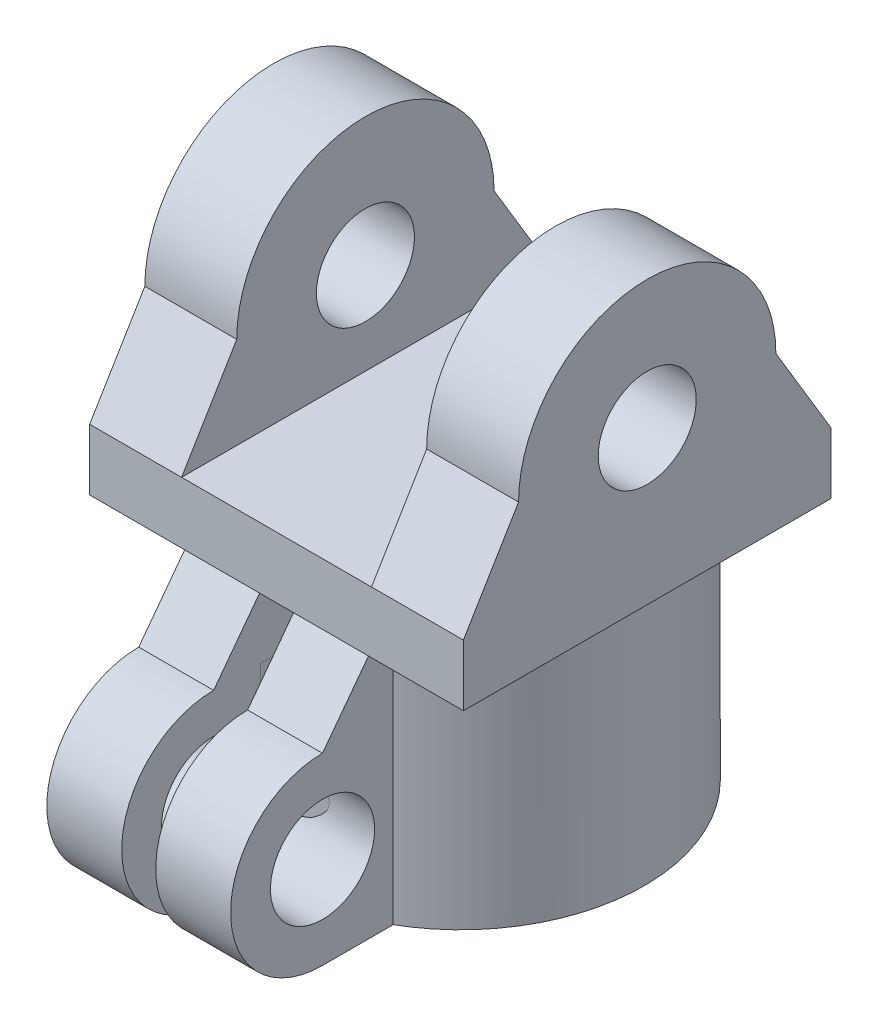
ISO-10303-21;
HEADER;
FILE_DESCRIPTION(('STEP AP214'),'2;1');
FILE_NAME('part.step','',(''),(''),'','','');
FILE_SCHEMA(('AUTOMOTIVE_DESIGN { 1 0 10303 214 1 1 1 1 }'));
ENDSEC;
DATA;
#1=APPLICATION_CONTEXT('core data for automotive mechanical design processes');
#2=APPLICATION_PROTOCOL_DEFINITION('international standard','automotive_design',2000,#1);
#3=PRODUCT_CONTEXT('',#1,'mechanical');
#4=PRODUCT('Part','Part','',(#3));
#5=PRODUCT_RELATED_PRODUCT_CATEGORY('part','',(#4));
#6=PRODUCT_DEFINITION_FORMATION('','',#4);
#7=PRODUCT_DEFINITION_CONTEXT('part definition',#1,'design');
#8=PRODUCT_DEFINITION('design','',#6,#7);
#9=PRODUCT_DEFINITION_SHAPE('','',#8);
#10=(LENGTH_UNIT() NAMED_UNIT(*) SI_UNIT(.MILLI.,.METRE.));
#11=(NAMED_UNIT(*) PLANE_ANGLE_UNIT() SI_UNIT($,.RADIAN.));
#12=(NAMED_UNIT(*) SI_UNIT($,.STERADIAN.) SOLID_ANGLE_UNIT());
#13=UNCERTAINTY_MEASURE_WITH_UNIT(LENGTH_MEASURE(1.E-05),#10,'distance_accuracy_value','');
#14=(GEOMETRIC_REPRESENTATION_CONTEXT(3) GLOBAL_UNCERTAINTY_ASSIGNED_CONTEXT((#13)) GLOBAL_UNIT_ASSIGNED_CONTEXT((#10,
#11,#12)) REPRESENTATION_CONTEXT('',''));
#15=CARTESIAN_POINT('',(0.,0.,0.));
#16=DIRECTION('',(0.,0.,1.));
#17=DIRECTION('',(1.,0.,0.));
#18=AXIS2_PLACEMENT_3D('',#15,#16,#17);
#19=CARTESIAN_POINT('',(-3.,8.,0.));
#20=DIRECTION('',(0.,0.,-1.));
#21=DIRECTION('',(-1.,0.,0.));
#22=AXIS2_PLACEMENT_3D('',#19,#20,#21);
#23=PLANE('',#22);
#24=DIRECTION('',(1.,0.,0.));
#25=VECTOR('',#24,1.);
#26=CARTESIAN_POINT('',(-3.,8.,0.));
#27=LINE('',#26,#25);
#28=CARTESIAN_POINT('',(-3.,8.,0.));
#29=VERTEX_POINT('',#28);
#30=CARTESIAN_POINT('',(-0.554698457996553,8.,0.));
#31=VERTEX_POINT('',#30);
#32=EDGE_CURVE('E131',#29,#31,#27,.T.);
#33=ORIENTED_EDGE('',*,*,#32,.T.);
#34=DIRECTION('',(0.,-1.,0.));
#35=VECTOR('',#34,1.);
#36=CARTESIAN_POINT('',(-0.554698457996553,8.,0.));
#37=LINE('',#36,#35);
#38=CARTESIAN_POINT('',(-0.554698457996553,6.,0.));
#39=VERTEX_POINT('',#38);
#40=EDGE_CURVE('E108',#31,#39,#37,.T.);
#41=ORIENTED_EDGE('',*,*,#40,.T.);
#42=DIRECTION('',(-1.,0.,0.));
#43=VECTOR('',#42,1.);
#44=CARTESIAN_POINT('',(-3.,6.,0.));
#45=LINE('',#44,#43);
#46=CARTESIAN_POINT('',(-3.,6.,0.));
#47=VERTEX_POINT('',#46);
#48=EDGE_CURVE('E137',#39,#47,#45,.T.);
#49=ORIENTED_EDGE('',*,*,#48,.T.);
#50=DIRECTION('',(0.,1.,0.));
#51=VECTOR('',#50,1.);
#52=CARTESIAN_POINT('',(-3.,8.,0.));
#53=LINE('',#52,#51);
#54=EDGE_CURVE('E136',#47,#29,#53,.T.);
#55=ORIENTED_EDGE('',*,*,#54,.T.);
#56=EDGE_LOOP('',(#33,#41,#49,#55));
#57=FACE_BOUND('',#56,.T.);
#58=ADVANCED_FACE('F44',(#57),#23,.T.);
#59=CARTESIAN_POINT('',(-3.,3.,7.5));
#60=DIRECTION('',(1.,0.,0.));
#61=DIRECTION('',(0.,0.,-1.));
#62=AXIS2_PLACEMENT_3D('',#59,#60,#61);
#63=CYLINDRICAL_SURFACE('',#62,3.);
#64=DIRECTION('',(1.,0.,0.));
#65=VECTOR('',#64,1.);
#66=CARTESIAN_POINT('',(-3.,0.,7.5));
#67=LINE('',#66,#65);
#68=CARTESIAN_POINT('',(-3.,0.,7.5));
#69=VERTEX_POINT('',#68);
#70=CARTESIAN_POINT('',(-0.554698457996553,0.,7.5));
#71=VERTEX_POINT('',#70);
#72=EDGE_CURVE('E133',#69,#71,#67,.T.);
#73=ORIENTED_EDGE('',*,*,#72,.T.);
#74=CARTESIAN_POINT('',(-0.554698457996553,3.,7.5));
#75=DIRECTION('',(1.,0.,0.));
#76=DIRECTION('',(0.,0.,-1.));
#77=AXIS2_PLACEMENT_3D('',#74,#75,#76);
#78=CIRCLE('',#77,3.);
#79=CARTESIAN_POINT('',(-0.554698457996553,6.,7.5));
#80=VERTEX_POINT('',#79);
#81=EDGE_CURVE('E62',#71,#80,#78,.F.);
#82=ORIENTED_EDGE('',*,*,#81,.T.);
#83=DIRECTION('',(1.,0.,0.));
#84=VECTOR('',#83,1.);
#85=CARTESIAN_POINT('',(-3.,6.,7.5));
#86=LINE('',#85,#84);
#87=CARTESIAN_POINT('',(-3.,6.,7.5));
#88=VERTEX_POINT('',#87);
#89=EDGE_CURVE('E120',#88,#80,#86,.T.);
#90=ORIENTED_EDGE('',*,*,#89,.F.);
#91=CARTESIAN_POINT('',(-3.,3.,7.5));
#92=DIRECTION('',(1.,0.,0.));
#93=DIRECTION('',(0.,0.,-1.));
#94=AXIS2_PLACEMENT_3D('',#91,#92,#93);
#95=CIRCLE('',#94,3.);
#96=EDGE_CURVE('E154',#88,#69,#95,.T.);
#97=ORIENTED_EDGE('',*,*,#96,.T.);
#98=EDGE_LOOP('',(#73,#82,#90,#97));
#99=FACE_BOUND('',#98,.T.);
#100=ADVANCED_FACE('F174',(#99),#63,.T.);
#101=CARTESIAN_POINT('',(-3.,6.,7.5));
#102=DIRECTION('',(0.,0.6,0.8));
#103=DIRECTION('',(0.,-0.8,0.6));
#104=AXIS2_PLACEMENT_3D('',#101,#102,#103);
#105=PLANE('',#104);
#106=ORIENTED_EDGE('',*,*,#89,.T.);
#107=DIRECTION('',(0.,0.8,-0.6));
#108=VECTOR('',#107,1.);
#109=CARTESIAN_POINT('',(-0.554698457996553,6.,7.5));
#110=LINE('',#109,#108);
#111=CARTESIAN_POINT('',(-0.554698457996553,8.,6.));
#112=VERTEX_POINT('',#111);
#113=EDGE_CURVE('E106',#80,#112,#110,.T.);
#114=ORIENTED_EDGE('',*,*,#113,.T.);
#115=DIRECTION('',(1.,0.,0.));
#116=VECTOR('',#115,1.);
#117=CARTESIAN_POINT('',(-3.,8.,6.));
#118=LINE('',#117,#116);
#119=CARTESIAN_POINT('',(-3.,8.,6.));
#120=VERTEX_POINT('',#119);
#121=EDGE_CURVE('E114',#120,#112,#118,.T.);
#122=ORIENTED_EDGE('',*,*,#121,.F.);
#123=DIRECTION('',(0.,-0.8,0.6));
#124=VECTOR('',#123,1.);
#125=CARTESIAN_POINT('',(-3.,6.,7.5));
#126=LINE('',#125,#124);
#127=EDGE_CURVE('E121',#120,#88,#126,.T.);
#128=ORIENTED_EDGE('',*,*,#127,.T.);
#129=EDGE_LOOP('',(#106,#114,#122,#128));
#130=FACE_BOUND('',#129,.T.);
#131=ADVANCED_FACE('F117',(#130),#105,.T.);
#132=CARTESIAN_POINT('',(-3.,8.,6.));
#133=DIRECTION('',(0.,1.,0.));
#134=DIRECTION('',(0.,0.,1.));
#135=AXIS2_PLACEMENT_3D('',#132,#133,#134);
#136=PLANE('',#135);
#137=ORIENTED_EDGE('',*,*,#121,.T.);
#138=DIRECTION('',(0.,0.,-1.));
#139=VECTOR('',#138,1.);
#140=CARTESIAN_POINT('',(-0.554698457996553,8.,10.5));
#141=LINE('',#140,#139);
#142=EDGE_CURVE('E102',#112,#31,#141,.T.);
#143=ORIENTED_EDGE('',*,*,#142,.T.);
#144=ORIENTED_EDGE('',*,*,#32,.F.);
#145=DIRECTION('',(0.,0.,1.));
#146=VECTOR('',#145,1.);
#147=CARTESIAN_POINT('',(-3.,8.,6.));
#148=LINE('',#147,#146);
#149=EDGE_CURVE('E113',#29,#120,#148,.T.);
#150=ORIENTED_EDGE('',*,*,#149,.T.);
#151=EDGE_LOOP('',(#137,#143,#144,#150));
#152=FACE_BOUND('',#151,.T.);
#153=ADVANCED_FACE('F123',(#152),#136,.T.);
#154=CARTESIAN_POINT('',(-3.,0.,0.));
#155=DIRECTION('',(0.,-1.,0.));
#156=DIRECTION('',(0.,0.,-1.));
#157=AXIS2_PLACEMENT_3D('',#154,#155,#156);
#158=PLANE('',#157);
#159=CARTESIAN_POINT('',(0.,0.,0.));
#160=DIRECTION('',(0.,-1.,0.));
#161=DIRECTION('',(0.,0.,-1.));
#162=AXIS2_PLACEMENT_3D('',#159,#160,#161);
#163=CIRCLE('',#162,4.2);
#164=CARTESIAN_POINT('',(-0.554698457996553,0.,4.16320905320598));
#165=VERTEX_POINT('',#164);
#166=CARTESIAN_POINT('',(-3.,0.,2.93938769133981));
#167=VERTEX_POINT('',#166);
#168=EDGE_CURVE('E47',#165,#167,#163,.T.);
#169=ORIENTED_EDGE('',*,*,#168,.F.);
#170=DIRECTION('',(0.,0.,-1.));
#171=VECTOR('',#170,1.);
#172=CARTESIAN_POINT('',(-0.554698457996553,0.,10.5));
#173=LINE('',#172,#171);
#174=EDGE_CURVE('E161',#71,#165,#173,.T.);
#175=ORIENTED_EDGE('',*,*,#174,.F.);
#176=ORIENTED_EDGE('',*,*,#72,.F.);
#177=DIRECTION('',(0.,0.,-1.));
#178=VECTOR('',#177,1.);
#179=CARTESIAN_POINT('',(-3.,0.,0.));
#180=LINE('',#179,#178);
#181=EDGE_CURVE('E148',#69,#167,#180,.T.);
#182=ORIENTED_EDGE('',*,*,#181,.T.);
#183=EDGE_LOOP('',(#169,#175,#176,#182));
#184=FACE_BOUND('',#183,.T.);
#185=ADVANCED_FACE('F177',(#184),#158,.T.);
#186=CARTESIAN_POINT('',(-3.,3.,7.5));
#187=DIRECTION('',(1.,0.,0.));
#188=DIRECTION('',(0.,0.,-1.));
#189=AXIS2_PLACEMENT_3D('',#186,#187,#188);
#190=CYLINDRICAL_SURFACE('',#189,1.7);
#191=CARTESIAN_POINT('',(-3.,3.,7.5));
#192=DIRECTION('',(1.,0.,0.));
#193=DIRECTION('',(0.,0.,-1.));
#194=AXIS2_PLACEMENT_3D('',#191,#192,#193);
#195=CIRCLE('',#194,1.7);
#196=CARTESIAN_POINT('',(-3.,3.,5.8));
#197=VERTEX_POINT('',#196);
#198=EDGE_CURVE('E144',#197,#197,#195,.T.);
#199=ORIENTED_EDGE('',*,*,#198,.F.);
#200=EDGE_LOOP('',(#199));
#201=FACE_BOUND('',#200,.T.);
#202=CARTESIAN_POINT('',(-0.554698457996553,3.,7.5));
#203=DIRECTION('',(1.,0.,0.));
#204=DIRECTION('',(0.,0.,-1.));
#205=AXIS2_PLACEMENT_3D('',#202,#203,#204);
#206=CIRCLE('',#205,1.7);
#207=CARTESIAN_POINT('',(-0.554698457996553,3.,5.8));
#208=VERTEX_POINT('',#207);
#209=EDGE_CURVE('E12',#208,#208,#206,.F.);
#210=ORIENTED_EDGE('',*,*,#209,.F.);
#211=EDGE_LOOP('',(#210));
#212=FACE_BOUND('',#211,.T.);
#213=ADVANCED_FACE('F181',(#201,#212),#190,.F.);
#214=CARTESIAN_POINT('',(0.,6.,0.));
#215=DIRECTION('',(0.,-1.,0.));
#216=DIRECTION('',(0.,0.,-1.));
#217=AXIS2_PLACEMENT_3D('',#214,#215,#216);
#218=CYLINDRICAL_SURFACE('',#217,4.2);
#219=DIRECTION('',(0.,-1.,0.));
#220=VECTOR('',#219,1.);
#221=CARTESIAN_POINT('',(-0.554698457996553,6.,4.16320905320598));
#222=LINE('',#221,#220);
#223=CARTESIAN_POINT('',(-0.554698457996553,6.,4.16320905320598));
#224=VERTEX_POINT('',#223);
#225=EDGE_CURVE('E53',#165,#224,#222,.F.);
#226=ORIENTED_EDGE('',*,*,#225,.F.);
#227=ORIENTED_EDGE('',*,*,#168,.T.);
#228=DIRECTION('',(0.,-1.,0.));
#229=VECTOR('',#228,1.);
#230=CARTESIAN_POINT('',(-3.,6.,2.93938769133981));
#231=LINE('',#230,#229);
#232=CARTESIAN_POINT('',(-3.,6.,2.93938769133981));
#233=VERTEX_POINT('',#232);
#234=EDGE_CURVE('E159',#233,#167,#231,.T.);
#235=ORIENTED_EDGE('',*,*,#234,.F.);
#236=CARTESIAN_POINT('',(0.,6.,0.));
#237=DIRECTION('',(0.,-1.,0.));
#238=DIRECTION('',(0.,0.,-1.));
#239=AXIS2_PLACEMENT_3D('',#236,#237,#238);
#240=CIRCLE('',#239,4.2);
#241=EDGE_CURVE('E138',#224,#233,#240,.T.);
#242=ORIENTED_EDGE('',*,*,#241,.F.);
#243=EDGE_LOOP('',(#226,#227,#235,#242));
#244=FACE_BOUND('',#243,.T.);
#245=ADVANCED_FACE('F179',(#244),#218,.F.);
#246=CARTESIAN_POINT('',(0.,6.,0.));
#247=DIRECTION('',(0.,-1.,0.));
#248=DIRECTION('',(0.,0.,-1.));
#249=AXIS2_PLACEMENT_3D('',#246,#247,#248);
#250=PLANE('',#249);
#251=ORIENTED_EDGE('',*,*,#48,.F.);
#252=DIRECTION('',(0.,0.,1.));
#253=VECTOR('',#252,1.);
#254=CARTESIAN_POINT('',(-0.554698457996553,6.,0.));
#255=LINE('',#254,#253);
#256=EDGE_CURVE('E75',#39,#224,#255,.T.);
#257=ORIENTED_EDGE('',*,*,#256,.T.);
#258=ORIENTED_EDGE('',*,*,#241,.T.);
#259=DIRECTION('',(0.,0.,-1.));
#260=VECTOR('',#259,1.);
#261=CARTESIAN_POINT('',(-3.,6.,7.5));
#262=LINE('',#261,#260);
#263=EDGE_CURVE('E139',#233,#47,#262,.T.);
#264=ORIENTED_EDGE('',*,*,#263,.T.);
#265=EDGE_LOOP('',(#251,#257,#258,#264));
#266=FACE_BOUND('',#265,.T.);
#267=ADVANCED_FACE('F166',(#266),#250,.T.);
#268=CARTESIAN_POINT('',(-3.,3.,7.5));
#269=DIRECTION('',(1.,0.,0.));
#270=DIRECTION('',(0.,0.,-1.));
#271=AXIS2_PLACEMENT_3D('',#268,#269,#270);
#272=PLANE('',#271);
#273=ORIENTED_EDGE('',*,*,#198,.T.);
#274=EDGE_LOOP('',(#273));
#275=FACE_BOUND('',#274,.T.);
#276=ORIENTED_EDGE('',*,*,#263,.F.);
#277=ORIENTED_EDGE('',*,*,#234,.T.);
#278=ORIENTED_EDGE('',*,*,#181,.F.);
#279=ORIENTED_EDGE('',*,*,#96,.F.);
#280=ORIENTED_EDGE('',*,*,#127,.F.);
#281=ORIENTED_EDGE('',*,*,#149,.F.);
#282=ORIENTED_EDGE('',*,*,#54,.F.);
#283=EDGE_LOOP('',(#276,#277,#278,#279,#280,#281,#282));
#284=FACE_BOUND('',#283,.T.);
#285=ADVANCED_FACE('F170',(#275,#284),#272,.F.);
#286=CARTESIAN_POINT('',(-0.554698457996553,8.,10.5));
#287=DIRECTION('',(1.,0.,0.));
#288=DIRECTION('',(0.,0.,-1.));
#289=AXIS2_PLACEMENT_3D('',#286,#287,#288);
#290=PLANE('',#289);
#291=ORIENTED_EDGE('',*,*,#174,.T.);
#292=ORIENTED_EDGE('',*,*,#225,.T.);
#293=ORIENTED_EDGE('',*,*,#256,.F.);
#294=ORIENTED_EDGE('',*,*,#40,.F.);
#295=ORIENTED_EDGE('',*,*,#142,.F.);
#296=ORIENTED_EDGE('',*,*,#113,.F.);
#297=ORIENTED_EDGE('',*,*,#81,.F.);
#298=EDGE_LOOP('',(#291,#292,#293,#294,#295,#296,#297));
#299=FACE_BOUND('',#298,.T.);
#300=ORIENTED_EDGE('',*,*,#209,.T.);
#301=EDGE_LOOP('',(#300));
#302=FACE_BOUND('',#301,.T.);
#303=ADVANCED_FACE('F104',(#299,#302),#290,.T.);
#304=CLOSED_SHELL('',(#58,#100,#131,#153,#185,#213,#245,#267,#285,#303));
#305=MANIFOLD_SOLID_BREP('B2',#304);
#306=CARTESIAN_POINT('',(-3.,3.,7.5));
#307=DIRECTION('',(1.,0.,0.));
#308=DIRECTION('',(0.,0.,-1.));
#309=AXIS2_PLACEMENT_3D('',#306,#307,#308);
#310=CYLINDRICAL_SURFACE('',#309,1.7);
#311=CARTESIAN_POINT('',(3.,3.,7.5));
#312=DIRECTION('',(1.,0.,0.));
#313=DIRECTION('',(0.,0.,-1.));
#314=AXIS2_PLACEMENT_3D('',#311,#312,#313);
#315=CIRCLE('',#314,1.7);
#316=CARTESIAN_POINT('',(3.,3.,5.8));
#317=VERTEX_POINT('',#316);
#318=EDGE_CURVE('E392',#317,#317,#315,.T.);
#319=ORIENTED_EDGE('',*,*,#318,.T.);
#320=EDGE_LOOP('',(#319));
#321=FACE_BOUND('',#320,.T.);
#322=CARTESIAN_POINT('',(0.554698457996553,3.,7.5));
#323=DIRECTION('',(-1.,0.,0.));
#324=DIRECTION('',(0.,0.,1.));
#325=AXIS2_PLACEMENT_3D('',#322,#323,#324);
#326=CIRCLE('',#325,1.7);
#327=CARTESIAN_POINT('',(0.554698457996553,3.,9.2));
#328=VERTEX_POINT('',#327);
#329=EDGE_CURVE('E405',#328,#328,#326,.F.);
#330=ORIENTED_EDGE('',*,*,#329,.F.);
#331=EDGE_LOOP('',(#330));
#332=FACE_BOUND('',#331,.T.);
#333=ADVANCED_FACE('F276',(#321,#332),#310,.F.);
#334=CARTESIAN_POINT('',(3.,3.,7.5));
#335=DIRECTION('',(1.,0.,0.));
#336=DIRECTION('',(0.,0.,-1.));
#337=AXIS2_PLACEMENT_3D('',#334,#335,#336);
#338=PLANE('',#337);
#339=DIRECTION('',(0.,-1.,0.));
#340=VECTOR('',#339,1.);
#341=CARTESIAN_POINT('',(3.,6.,2.93938769133981));
#342=LINE('',#341,#340);
#343=CARTESIAN_POINT('',(3.,6.,2.93938769133981));
#344=VERTEX_POINT('',#343);
#345=CARTESIAN_POINT('',(3.,0.,2.93938769133981));
#346=VERTEX_POINT('',#345);
#347=EDGE_CURVE('E284',#344,#346,#342,.T.);
#348=ORIENTED_EDGE('',*,*,#347,.F.);
#349=DIRECTION('',(0.,0.,-1.));
#350=VECTOR('',#349,1.);
#351=CARTESIAN_POINT('',(3.,6.,7.5));
#352=LINE('',#351,#350);
#353=CARTESIAN_POINT('',(3.,6.,0.));
#354=VERTEX_POINT('',#353);
#355=EDGE_CURVE('E361',#344,#354,#352,.T.);
#356=ORIENTED_EDGE('',*,*,#355,.T.);
#357=DIRECTION('',(0.,1.,0.));
#358=VECTOR('',#357,1.);
#359=CARTESIAN_POINT('',(3.,8.,0.));
#360=LINE('',#359,#358);
#361=CARTESIAN_POINT('',(3.,8.,0.));
#362=VERTEX_POINT('',#361);
#363=EDGE_CURVE('E389',#354,#362,#360,.T.);
#364=ORIENTED_EDGE('',*,*,#363,.T.);
#365=DIRECTION('',(0.,0.,1.));
#366=VECTOR('',#365,1.);
#367=CARTESIAN_POINT('',(3.,8.,6.));
#368=LINE('',#367,#366);
#369=CARTESIAN_POINT('',(3.,8.,6.));
#370=VERTEX_POINT('',#369);
#371=EDGE_CURVE('E351',#362,#370,#368,.T.);
#372=ORIENTED_EDGE('',*,*,#371,.T.);
#373=DIRECTION('',(0.,-0.8,0.6));
#374=VECTOR('',#373,1.);
#375=CARTESIAN_POINT('',(3.,6.,7.5));
#376=LINE('',#375,#374);
#377=CARTESIAN_POINT('',(3.,6.,7.5));
#378=VERTEX_POINT('',#377);
#379=EDGE_CURVE('E357',#370,#378,#376,.T.);
#380=ORIENTED_EDGE('',*,*,#379,.T.);
#381=CARTESIAN_POINT('',(3.,3.,7.5));
#382=DIRECTION('',(1.,0.,0.));
#383=DIRECTION('',(0.,0.,-1.));
#384=AXIS2_PLACEMENT_3D('',#381,#382,#383);
#385=CIRCLE('',#384,3.);
#386=CARTESIAN_POINT('',(3.,0.,7.5));
#387=VERTEX_POINT('',#386);
#388=EDGE_CURVE('E388',#378,#387,#385,.T.);
#389=ORIENTED_EDGE('',*,*,#388,.T.);
#390=DIRECTION('',(0.,0.,-1.));
#391=VECTOR('',#390,1.);
#392=CARTESIAN_POINT('',(3.,0.,0.));
#393=LINE('',#392,#391);
#394=EDGE_CURVE('E379',#387,#346,#393,.T.);
#395=ORIENTED_EDGE('',*,*,#394,.T.);
#396=EDGE_LOOP('',(#348,#356,#364,#372,#380,#389,#395));
#397=FACE_BOUND('',#396,.T.);
#398=ORIENTED_EDGE('',*,*,#318,.F.);
#399=EDGE_LOOP('',(#398));
#400=FACE_BOUND('',#399,.T.);
#401=ADVANCED_FACE('F384',(#397,#400),#338,.T.);
#402=CARTESIAN_POINT('',(-3.,8.,6.));
#403=DIRECTION('',(0.,1.,0.));
#404=DIRECTION('',(0.,0.,1.));
#405=AXIS2_PLACEMENT_3D('',#402,#403,#404);
#406=PLANE('',#405);
#407=DIRECTION('',(1.,0.,0.));
#408=VECTOR('',#407,1.);
#409=CARTESIAN_POINT('',(-3.,8.,0.));
#410=LINE('',#409,#408);
#411=CARTESIAN_POINT('',(0.554698457996553,8.,0.));
#412=VERTEX_POINT('',#411);
#413=EDGE_CURVE('E345',#412,#362,#410,.T.);
#414=ORIENTED_EDGE('',*,*,#413,.F.);
#415=DIRECTION('',(0.,0.,-1.));
#416=VECTOR('',#415,1.);
#417=CARTESIAN_POINT('',(0.554698457996553,8.,10.5));
#418=LINE('',#417,#416);
#419=CARTESIAN_POINT('',(0.554698457996553,8.,6.));
#420=VERTEX_POINT('',#419);
#421=EDGE_CURVE('E332',#420,#412,#418,.T.);
#422=ORIENTED_EDGE('',*,*,#421,.F.);
#423=DIRECTION('',(1.,0.,0.));
#424=VECTOR('',#423,1.);
#425=CARTESIAN_POINT('',(-3.,8.,6.));
#426=LINE('',#425,#424);
#427=EDGE_CURVE('E352',#420,#370,#426,.T.);
#428=ORIENTED_EDGE('',*,*,#427,.T.);
#429=ORIENTED_EDGE('',*,*,#371,.F.);
#430=EDGE_LOOP('',(#414,#422,#428,#429));
#431=FACE_BOUND('',#430,.T.);
#432=ADVANCED_FACE('F349',(#431),#406,.T.);
#433=CARTESIAN_POINT('',(-3.,6.,7.5));
#434=DIRECTION('',(0.,0.6,0.8));
#435=DIRECTION('',(0.,-0.8,0.6));
#436=AXIS2_PLACEMENT_3D('',#433,#434,#435);
#437=PLANE('',#436);
#438=ORIENTED_EDGE('',*,*,#427,.F.);
#439=DIRECTION('',(0.,-0.8,0.6));
#440=VECTOR('',#439,1.);
#441=CARTESIAN_POINT('',(0.554698457996553,6.,7.5));
#442=LINE('',#441,#440);
#443=CARTESIAN_POINT('',(0.554698457996553,6.,7.5));
#444=VERTEX_POINT('',#443);
#445=EDGE_CURVE('E336',#420,#444,#442,.T.);
#446=ORIENTED_EDGE('',*,*,#445,.T.);
#447=DIRECTION('',(1.,0.,0.));
#448=VECTOR('',#447,1.);
#449=CARTESIAN_POINT('',(-3.,6.,7.5));
#450=LINE('',#449,#448);
#451=EDGE_CURVE('E355',#444,#378,#450,.T.);
#452=ORIENTED_EDGE('',*,*,#451,.T.);
#453=ORIENTED_EDGE('',*,*,#379,.F.);
#454=EDGE_LOOP('',(#438,#446,#452,#453));
#455=FACE_BOUND('',#454,.T.);
#456=ADVANCED_FACE('F400',(#455),#437,.T.);
#457=CARTESIAN_POINT('',(0.,6.,0.));
#458=DIRECTION('',(0.,-1.,0.));
#459=DIRECTION('',(0.,0.,-1.));
#460=AXIS2_PLACEMENT_3D('',#457,#458,#459);
#461=PLANE('',#460);
#462=CARTESIAN_POINT('',(0.,6.,0.));
#463=DIRECTION('',(0.,-1.,0.));
#464=DIRECTION('',(0.,0.,-1.));
#465=AXIS2_PLACEMENT_3D('',#462,#463,#464);
#466=CIRCLE('',#465,4.2);
#467=CARTESIAN_POINT('',(0.554698457996553,6.,4.16320905320598));
#468=VERTEX_POINT('',#467);
#469=EDGE_CURVE('E371',#344,#468,#466,.T.);
#470=ORIENTED_EDGE('',*,*,#469,.T.);
#471=DIRECTION('',(0.,0.,-1.));
#472=VECTOR('',#471,1.);
#473=CARTESIAN_POINT('',(0.554698457996553,6.,0.));
#474=LINE('',#473,#472);
#475=CARTESIAN_POINT('',(0.554698457996553,6.,0.));
#476=VERTEX_POINT('',#475);
#477=EDGE_CURVE('E42',#468,#476,#474,.T.);
#478=ORIENTED_EDGE('',*,*,#477,.T.);
#479=DIRECTION('',(-1.,0.,0.));
#480=VECTOR('',#479,1.);
#481=CARTESIAN_POINT('',(-3.,6.,0.));
#482=LINE('',#481,#480);
#483=EDGE_CURVE('E297',#354,#476,#482,.T.);
#484=ORIENTED_EDGE('',*,*,#483,.F.);
#485=ORIENTED_EDGE('',*,*,#355,.F.);
#486=EDGE_LOOP('',(#470,#478,#484,#485));
#487=FACE_BOUND('',#486,.T.);
#488=ADVANCED_FACE('F428',(#487),#461,.T.);
#489=CARTESIAN_POINT('',(0.,6.,0.));
#490=DIRECTION('',(0.,-1.,0.));
#491=DIRECTION('',(0.,0.,-1.));
#492=AXIS2_PLACEMENT_3D('',#489,#490,#491);
#493=CYLINDRICAL_SURFACE('',#492,4.2);
#494=DIRECTION('',(0.,-1.,0.));
#495=VECTOR('',#494,1.);
#496=CARTESIAN_POINT('',(0.554698457996553,6.,4.16320905320598));
#497=LINE('',#496,#495);
#498=CARTESIAN_POINT('',(0.554698457996553,0.,4.16320905320598));
#499=VERTEX_POINT('',#498);
#500=EDGE_CURVE('E403',#468,#499,#497,.T.);
#501=ORIENTED_EDGE('',*,*,#500,.F.);
#502=ORIENTED_EDGE('',*,*,#469,.F.);
#503=ORIENTED_EDGE('',*,*,#347,.T.);
#504=CARTESIAN_POINT('',(0.,0.,0.));
#505=DIRECTION('',(0.,-1.,0.));
#506=DIRECTION('',(0.,0.,-1.));
#507=AXIS2_PLACEMENT_3D('',#504,#505,#506);
#508=CIRCLE('',#507,4.2);
#509=EDGE_CURVE('E369',#346,#499,#508,.T.);
#510=ORIENTED_EDGE('',*,*,#509,.T.);
#511=EDGE_LOOP('',(#501,#502,#503,#510));
#512=FACE_BOUND('',#511,.T.);
#513=ADVANCED_FACE('F368',(#512),#493,.F.);
#514=CARTESIAN_POINT('',(-3.,0.,0.));
#515=DIRECTION('',(0.,-1.,0.));
#516=DIRECTION('',(0.,0.,-1.));
#517=AXIS2_PLACEMENT_3D('',#514,#515,#516);
#518=PLANE('',#517);
#519=DIRECTION('',(1.,0.,0.));
#520=VECTOR('',#519,1.);
#521=CARTESIAN_POINT('',(-3.,0.,7.5));
#522=LINE('',#521,#520);
#523=CARTESIAN_POINT('',(0.554698457996553,0.,7.5));
#524=VERTEX_POINT('',#523);
#525=EDGE_CURVE('E353',#524,#387,#522,.T.);
#526=ORIENTED_EDGE('',*,*,#525,.F.);
#527=DIRECTION('',(0.,0.,-1.));
#528=VECTOR('',#527,1.);
#529=CARTESIAN_POINT('',(0.554698457996553,0.,10.5));
#530=LINE('',#529,#528);
#531=EDGE_CURVE('E340',#524,#499,#530,.T.);
#532=ORIENTED_EDGE('',*,*,#531,.T.);
#533=ORIENTED_EDGE('',*,*,#509,.F.);
#534=ORIENTED_EDGE('',*,*,#394,.F.);
#535=EDGE_LOOP('',(#526,#532,#533,#534));
#536=FACE_BOUND('',#535,.T.);
#537=ADVANCED_FACE('F378',(#536),#518,.T.);
#538=CARTESIAN_POINT('',(-3.,3.,7.5));
#539=DIRECTION('',(1.,0.,0.));
#540=DIRECTION('',(0.,0.,-1.));
#541=AXIS2_PLACEMENT_3D('',#538,#539,#540);
#542=CYLINDRICAL_SURFACE('',#541,3.);
#543=CARTESIAN_POINT('',(0.554698457996553,3.,7.5));
#544=DIRECTION('',(-1.,0.,0.));
#545=DIRECTION('',(0.,0.,1.));
#546=AXIS2_PLACEMENT_3D('',#543,#544,#545);
#547=CIRCLE('',#546,3.);
#548=EDGE_CURVE('E382',#444,#524,#547,.F.);
#549=ORIENTED_EDGE('',*,*,#548,.T.);
#550=ORIENTED_EDGE('',*,*,#525,.T.);
#551=ORIENTED_EDGE('',*,*,#388,.F.);
#552=ORIENTED_EDGE('',*,*,#451,.F.);
#553=EDGE_LOOP('',(#549,#550,#551,#552));
#554=FACE_BOUND('',#553,.T.);
#555=ADVANCED_FACE('F278',(#554),#542,.T.);
#556=CARTESIAN_POINT('',(-3.,8.,0.));
#557=DIRECTION('',(0.,0.,-1.));
#558=DIRECTION('',(-1.,0.,0.));
#559=AXIS2_PLACEMENT_3D('',#556,#557,#558);
#560=PLANE('',#559);
#561=ORIENTED_EDGE('',*,*,#483,.T.);
#562=DIRECTION('',(0.,1.,0.));
#563=VECTOR('',#562,1.);
#564=CARTESIAN_POINT('',(0.554698457996553,8.,0.));
#565=LINE('',#564,#563);
#566=EDGE_CURVE('E291',#476,#412,#565,.T.);
#567=ORIENTED_EDGE('',*,*,#566,.T.);
#568=ORIENTED_EDGE('',*,*,#413,.T.);
#569=ORIENTED_EDGE('',*,*,#363,.F.);
#570=EDGE_LOOP('',(#561,#567,#568,#569));
#571=FACE_BOUND('',#570,.T.);
#572=ADVANCED_FACE('F343',(#571),#560,.T.);
#573=CARTESIAN_POINT('',(0.554698457996553,8.,10.5));
#574=DIRECTION('',(-1.,0.,0.));
#575=DIRECTION('',(0.,0.,1.));
#576=AXIS2_PLACEMENT_3D('',#573,#574,#575);
#577=PLANE('',#576);
#578=ORIENTED_EDGE('',*,*,#548,.F.);
#579=ORIENTED_EDGE('',*,*,#445,.F.);
#580=ORIENTED_EDGE('',*,*,#421,.T.);
#581=ORIENTED_EDGE('',*,*,#566,.F.);
#582=ORIENTED_EDGE('',*,*,#477,.F.);
#583=ORIENTED_EDGE('',*,*,#500,.T.);
#584=ORIENTED_EDGE('',*,*,#531,.F.);
#585=EDGE_LOOP('',(#578,#579,#580,#581,#582,#583,#584));
#586=FACE_BOUND('',#585,.T.);
#587=ORIENTED_EDGE('',*,*,#329,.T.);
#588=EDGE_LOOP('',(#587));
#589=FACE_BOUND('',#588,.T.);
#590=ADVANCED_FACE('F333',(#586,#589),#577,.T.);
#591=CLOSED_SHELL('',(#333,#401,#432,#456,#488,#513,#537,#555,#572,#590));
#592=MANIFOLD_SOLID_BREP('B6',#591);
#593=CARTESIAN_POINT('',(0.,0.,0.));
#594=DIRECTION('',(0.,1.,0.));
#595=DIRECTION('',(0.,0.,1.));
#596=AXIS2_PLACEMENT_3D('',#593,#594,#595);
#597=PLANE('',#596);
#598=DIRECTION('',(0.,0.,-1.));
#599=VECTOR('',#598,1.);
#600=CARTESIAN_POINT('',(-0.554698457996553,0.,10.5));
#601=LINE('',#600,#599);
#602=CARTESIAN_POINT('',(-0.554698457996553,0.,5.97430411183564));
#603=VERTEX_POINT('',#602);
#604=CARTESIAN_POINT('',(-0.554698457996553,0.,4.16320905320598));
#605=VERTEX_POINT('',#604);
#606=EDGE_CURVE('E606',#603,#605,#601,.T.);
#607=ORIENTED_EDGE('',*,*,#606,.F.);
#608=CARTESIAN_POINT('',(0.,0.,0.));
#609=DIRECTION('',(0.,1.,0.));
#610=DIRECTION('',(0.,0.,1.));
#611=AXIS2_PLACEMENT_3D('',#608,#609,#610);
#612=CIRCLE('',#611,6.);
#613=CARTESIAN_POINT('',(0.554698457996553,0.,5.97430411183564));
#614=VERTEX_POINT('',#613);
#615=EDGE_CURVE('E503',#614,#603,#612,.T.);
#616=ORIENTED_EDGE('',*,*,#615,.F.);
#617=DIRECTION('',(0.,0.,-1.));
#618=VECTOR('',#617,1.);
#619=CARTESIAN_POINT('',(0.554698457996553,0.,10.5));
#620=LINE('',#619,#618);
#621=CARTESIAN_POINT('',(0.554698457996553,0.,4.16320905320598));
#622=VERTEX_POINT('',#621);
#623=EDGE_CURVE('E623',#614,#622,#620,.T.);
#624=ORIENTED_EDGE('',*,*,#623,.T.);
#625=CARTESIAN_POINT('',(0.,0.,0.));
#626=DIRECTION('',(0.,1.,0.));
#627=DIRECTION('',(0.,0.,1.));
#628=AXIS2_PLACEMENT_3D('',#625,#626,#627);
#629=CIRCLE('',#628,4.2);
#630=EDGE_CURVE('E622',#622,#605,#629,.T.);
#631=ORIENTED_EDGE('',*,*,#630,.T.);
#632=EDGE_LOOP('',(#607,#616,#624,#631));
#633=FACE_BOUND('',#632,.T.);
#634=ADVANCED_FACE('F499',(#633),#597,.F.);
#635=CARTESIAN_POINT('',(0.,8.,0.));
#636=DIRECTION('',(0.,-1.,0.));
#637=DIRECTION('',(0.,0.,-1.));
#638=AXIS2_PLACEMENT_3D('',#635,#636,#637);
#639=CYLINDRICAL_SURFACE('',#638,6.);
#640=DIRECTION('',(0.,-1.,0.));
#641=VECTOR('',#640,1.);
#642=CARTESIAN_POINT('',(-0.554698457996553,8.,5.97430411183564));
#643=LINE('',#642,#641);
#644=CARTESIAN_POINT('',(-0.554698457996553,8.,5.97430411183564));
#645=VERTEX_POINT('',#644);
#646=EDGE_CURVE('E603',#645,#603,#643,.T.);
#647=ORIENTED_EDGE('',*,*,#646,.F.);
#648=CARTESIAN_POINT('',(0.,8.,0.));
#649=DIRECTION('',(0.,1.,0.));
#650=DIRECTION('',(0.,0.,1.));
#651=AXIS2_PLACEMENT_3D('',#648,#649,#650);
#652=CIRCLE('',#651,6.);
#653=CARTESIAN_POINT('',(0.,8.,-6.));
#654=VERTEX_POINT('',#653);
#655=EDGE_CURVE('E508',#654,#645,#652,.T.);
#656=ORIENTED_EDGE('',*,*,#655,.F.);
#657=CARTESIAN_POINT('',(0.554698457996553,8.,5.97430411183564));
#658=VERTEX_POINT('',#657);
#659=EDGE_CURVE('E274',#658,#654,#652,.T.);
#660=ORIENTED_EDGE('',*,*,#659,.F.);
#661=DIRECTION('',(0.,-1.,0.));
#662=VECTOR('',#661,1.);
#663=CARTESIAN_POINT('',(0.554698457996553,8.,5.97430411183564));
#664=LINE('',#663,#662);
#665=EDGE_CURVE('E627',#614,#658,#664,.F.);
#666=ORIENTED_EDGE('',*,*,#665,.F.);
#667=ORIENTED_EDGE('',*,*,#615,.T.);
#668=EDGE_LOOP('',(#647,#656,#660,#666,#667));
#669=FACE_BOUND('',#668,.T.);
#670=ADVANCED_FACE('F501',(#669),#639,.T.);
#671=CARTESIAN_POINT('',(0.,8.,0.));
#672=DIRECTION('',(0.,-1.,0.));
#673=DIRECTION('',(0.,0.,-1.));
#674=AXIS2_PLACEMENT_3D('',#671,#672,#673);
#675=CYLINDRICAL_SURFACE('',#674,4.2);
#676=CARTESIAN_POINT('',(0.,8.,0.));
#677=DIRECTION('',(0.,1.,0.));
#678=DIRECTION('',(0.,0.,1.));
#679=AXIS2_PLACEMENT_3D('',#676,#677,#678);
#680=CIRCLE('',#679,4.2);
#681=CARTESIAN_POINT('',(0.554698457996553,8.,4.16320905320598));
#682=VERTEX_POINT('',#681);
#683=CARTESIAN_POINT('',(-0.554698457996553,8.,4.16320905320598));
#684=VERTEX_POINT('',#683);
#685=EDGE_CURVE('E628',#682,#684,#680,.T.);
#686=ORIENTED_EDGE('',*,*,#685,.T.);
#687=DIRECTION('',(0.,-1.,0.));
#688=VECTOR('',#687,1.);
#689=CARTESIAN_POINT('',(-0.554698457996553,8.,4.16320905320598));
#690=LINE('',#689,#688);
#691=EDGE_CURVE('E615',#684,#605,#690,.T.);
#692=ORIENTED_EDGE('',*,*,#691,.T.);
#693=ORIENTED_EDGE('',*,*,#630,.F.);
#694=DIRECTION('',(0.,-1.,0.));
#695=VECTOR('',#694,1.);
#696=CARTESIAN_POINT('',(0.554698457996553,8.,4.16320905320598));
#697=LINE('',#696,#695);
#698=EDGE_CURVE('E614',#622,#682,#697,.F.);
#699=ORIENTED_EDGE('',*,*,#698,.T.);
#700=EDGE_LOOP('',(#686,#692,#693,#699));
#701=FACE_BOUND('',#700,.T.);
#702=ADVANCED_FACE('F733',(#701),#675,.F.);
#703=CARTESIAN_POINT('',(0.,10.,0.));
#704=DIRECTION('',(0.,-1.,0.));
#705=DIRECTION('',(0.,0.,-1.));
#706=AXIS2_PLACEMENT_3D('',#703,#704,#705);
#707=PLANE('',#706);
#708=DIRECTION('',(0.,0.,1.));
#709=VECTOR('',#708,1.);
#710=CARTESIAN_POINT('',(3.1,10.,-6.));
#711=LINE('',#710,#709);
#712=CARTESIAN_POINT('',(3.1,10.,-6.));
#713=VERTEX_POINT('',#712);
#714=CARTESIAN_POINT('',(3.1,10.,6.));
#715=VERTEX_POINT('',#714);
#716=EDGE_CURVE('E701',#713,#715,#711,.T.);
#717=ORIENTED_EDGE('',*,*,#716,.F.);
#718=DIRECTION('',(-1.,0.,0.));
#719=VECTOR('',#718,1.);
#720=CARTESIAN_POINT('',(-6.1,10.,-6.));
#721=LINE('',#720,#719);
#722=CARTESIAN_POINT('',(-3.1,10.,-6.));
#723=VERTEX_POINT('',#722);
#724=EDGE_CURVE('E648',#713,#723,#721,.T.);
#725=ORIENTED_EDGE('',*,*,#724,.T.);
#726=DIRECTION('',(0.,0.,1.));
#727=VECTOR('',#726,1.);
#728=CARTESIAN_POINT('',(-3.1,10.,-6.));
#729=LINE('',#728,#727);
#730=CARTESIAN_POINT('',(-3.1,10.,6.));
#731=VERTEX_POINT('',#730);
#732=EDGE_CURVE('E687',#723,#731,#729,.T.);
#733=ORIENTED_EDGE('',*,*,#732,.T.);
#734=DIRECTION('',(1.,0.,0.));
#735=VECTOR('',#734,1.);
#736=CARTESIAN_POINT('',(-6.1,10.,6.));
#737=LINE('',#736,#735);
#738=EDGE_CURVE('E661',#731,#715,#737,.T.);
#739=ORIENTED_EDGE('',*,*,#738,.T.);
#740=EDGE_LOOP('',(#717,#725,#733,#739));
#741=FACE_BOUND('',#740,.T.);
#742=ADVANCED_FACE('F763',(#741),#707,.F.);
#743=CARTESIAN_POINT('',(0.,8.,0.));
#744=DIRECTION('',(0.,-1.,0.));
#745=DIRECTION('',(0.,0.,-1.));
#746=AXIS2_PLACEMENT_3D('',#743,#744,#745);
#747=PLANE('',#746);
#748=DIRECTION('',(0.,0.,-1.));
#749=VECTOR('',#748,1.);
#750=CARTESIAN_POINT('',(6.1,8.,6.));
#751=LINE('',#750,#749);
#752=CARTESIAN_POINT('',(6.1,8.,6.));
#753=VERTEX_POINT('',#752);
#754=CARTESIAN_POINT('',(6.1,8.,-6.));
#755=VERTEX_POINT('',#754);
#756=EDGE_CURVE('E655',#753,#755,#751,.T.);
#757=ORIENTED_EDGE('',*,*,#756,.F.);
#758=DIRECTION('',(1.,0.,0.));
#759=VECTOR('',#758,1.);
#760=CARTESIAN_POINT('',(-6.1,8.,6.));
#761=LINE('',#760,#759);
#762=CARTESIAN_POINT('',(-6.1,8.,6.));
#763=VERTEX_POINT('',#762);
#764=EDGE_CURVE('E646',#763,#753,#761,.T.);
#765=ORIENTED_EDGE('',*,*,#764,.F.);
#766=DIRECTION('',(0.,0.,1.));
#767=VECTOR('',#766,1.);
#768=CARTESIAN_POINT('',(-6.1,8.,6.));
#769=LINE('',#768,#767);
#770=CARTESIAN_POINT('',(-6.1,8.,-6.));
#771=VERTEX_POINT('',#770);
#772=EDGE_CURVE('E649',#771,#763,#769,.T.);
#773=ORIENTED_EDGE('',*,*,#772,.F.);
#774=DIRECTION('',(-1.,0.,0.));
#775=VECTOR('',#774,1.);
#776=CARTESIAN_POINT('',(-6.1,8.,-6.));
#777=LINE('',#776,#775);
#778=EDGE_CURVE('E654',#654,#771,#777,.T.);
#779=ORIENTED_EDGE('',*,*,#778,.F.);
#780=ORIENTED_EDGE('',*,*,#655,.T.);
#781=DIRECTION('',(0.,0.,-1.));
#782=VECTOR('',#781,1.);
#783=CARTESIAN_POINT('',(-0.554698457996553,8.,10.5));
#784=LINE('',#783,#782);
#785=EDGE_CURVE('E609',#645,#684,#784,.T.);
#786=ORIENTED_EDGE('',*,*,#785,.T.);
#787=ORIENTED_EDGE('',*,*,#685,.F.);
#788=DIRECTION('',(0.,0.,-1.));
#789=VECTOR('',#788,1.);
#790=CARTESIAN_POINT('',(0.554698457996553,8.,10.5));
#791=LINE('',#790,#789);
#792=EDGE_CURVE('E515',#658,#682,#791,.T.);
#793=ORIENTED_EDGE('',*,*,#792,.F.);
#794=ORIENTED_EDGE('',*,*,#659,.T.);
#795=EDGE_CURVE('E651',#755,#654,#777,.T.);
#796=ORIENTED_EDGE('',*,*,#795,.F.);
#797=EDGE_LOOP('',(#757,#765,#773,#779,#780,#786,#787,#793,#794,#796));
#798=FACE_BOUND('',#797,.T.);
#799=ADVANCED_FACE('F737',(#798),#747,.T.);
#800=CARTESIAN_POINT('',(6.1,10.,6.));
#801=DIRECTION('',(-1.,0.,0.));
#802=DIRECTION('',(0.,0.,1.));
#803=AXIS2_PLACEMENT_3D('',#800,#801,#802);
#804=PLANE('',#803);
#805=ORIENTED_EDGE('',*,*,#756,.T.);
#806=DIRECTION('',(0.,-1.,0.));
#807=VECTOR('',#806,1.);
#808=CARTESIAN_POINT('',(6.1,10.,-6.));
#809=LINE('',#808,#807);
#810=CARTESIAN_POINT('',(6.1,10.,-6.));
#811=VERTEX_POINT('',#810);
#812=EDGE_CURVE('E631',#811,#755,#809,.T.);
#813=ORIENTED_EDGE('',*,*,#812,.F.);
#814=DIRECTION('',(0.,-0.857492925712544,-0.514495755427527));
#815=VECTOR('',#814,1.);
#816=CARTESIAN_POINT('',(6.1,13.,-4.2));
#817=LINE('',#816,#815);
#818=CARTESIAN_POINT('',(6.1,13.,-4.2));
#819=VERTEX_POINT('',#818);
#820=EDGE_CURVE('E710',#819,#811,#817,.T.);
#821=ORIENTED_EDGE('',*,*,#820,.F.);
#822=CARTESIAN_POINT('',(6.1,13.,0.));
#823=DIRECTION('',(-1.,0.,0.));
#824=DIRECTION('',(0.,0.,1.));
#825=AXIS2_PLACEMENT_3D('',#822,#823,#824);
#826=CIRCLE('',#825,4.2);
#827=CARTESIAN_POINT('',(6.1,13.,4.2));
#828=VERTEX_POINT('',#827);
#829=EDGE_CURVE('E708',#828,#819,#826,.T.);
#830=ORIENTED_EDGE('',*,*,#829,.F.);
#831=DIRECTION('',(0.,0.857492925712544,-0.514495755427527));
#832=VECTOR('',#831,1.);
#833=CARTESIAN_POINT('',(6.1,13.,4.2));
#834=LINE('',#833,#832);
#835=CARTESIAN_POINT('',(6.1,10.,6.));
#836=VERTEX_POINT('',#835);
#837=EDGE_CURVE('E705',#836,#828,#834,.T.);
#838=ORIENTED_EDGE('',*,*,#837,.F.);
#839=DIRECTION('',(0.,-1.,0.));
#840=VECTOR('',#839,1.);
#841=CARTESIAN_POINT('',(6.1,10.,6.));
#842=LINE('',#841,#840);
#843=EDGE_CURVE('E642',#836,#753,#842,.T.);
#844=ORIENTED_EDGE('',*,*,#843,.T.);
#845=EDGE_LOOP('',(#805,#813,#821,#830,#838,#844));
#846=FACE_BOUND('',#845,.T.);
#847=CARTESIAN_POINT('',(6.1,13.,0.));
#848=DIRECTION('',(-1.,0.,0.));
#849=DIRECTION('',(0.,0.,1.));
#850=AXIS2_PLACEMENT_3D('',#847,#848,#849);
#851=CIRCLE('',#850,1.6);
#852=CARTESIAN_POINT('',(6.1,13.,1.6));
#853=VERTEX_POINT('',#852);
#854=EDGE_CURVE('E722',#853,#853,#851,.T.);
#855=ORIENTED_EDGE('',*,*,#854,.T.);
#856=EDGE_LOOP('',(#855));
#857=FACE_BOUND('',#856,.T.);
#858=ADVANCED_FACE('F747',(#846,#857),#804,.F.);
#859=CARTESIAN_POINT('',(-6.1,10.,-6.));
#860=DIRECTION('',(0.,0.,1.));
#861=DIRECTION('',(1.,0.,0.));
#862=AXIS2_PLACEMENT_3D('',#859,#860,#861);
#863=PLANE('',#862);
#864=ORIENTED_EDGE('',*,*,#795,.T.);
#865=ORIENTED_EDGE('',*,*,#778,.T.);
#866=DIRECTION('',(0.,-1.,0.));
#867=VECTOR('',#866,1.);
#868=CARTESIAN_POINT('',(-6.1,10.,-6.));
#869=LINE('',#868,#867);
#870=CARTESIAN_POINT('',(-6.1,10.,-6.));
#871=VERTEX_POINT('',#870);
#872=EDGE_CURVE('E636',#871,#771,#869,.T.);
#873=ORIENTED_EDGE('',*,*,#872,.F.);
#874=DIRECTION('',(-1.,0.,0.));
#875=VECTOR('',#874,1.);
#876=CARTESIAN_POINT('',(-3.1,10.,-6.));
#877=LINE('',#876,#875);
#878=EDGE_CURVE('E665',#723,#871,#877,.T.);
#879=ORIENTED_EDGE('',*,*,#878,.F.);
#880=ORIENTED_EDGE('',*,*,#724,.F.);
#881=EDGE_CURVE('E662',#811,#713,#721,.T.);
#882=ORIENTED_EDGE('',*,*,#881,.F.);
#883=ORIENTED_EDGE('',*,*,#812,.T.);
#884=EDGE_LOOP('',(#864,#865,#873,#879,#880,#882,#883));
#885=FACE_BOUND('',#884,.T.);
#886=ADVANCED_FACE('F743',(#885),#863,.F.);
#887=CARTESIAN_POINT('',(-6.1,10.,6.));
#888=DIRECTION('',(1.,0.,0.));
#889=DIRECTION('',(0.,0.,-1.));
#890=AXIS2_PLACEMENT_3D('',#887,#888,#889);
#891=PLANE('',#890);
#892=DIRECTION('',(0.,-1.,0.));
#893=VECTOR('',#892,1.);
#894=CARTESIAN_POINT('',(-6.1,10.,6.));
#895=LINE('',#894,#893);
#896=CARTESIAN_POINT('',(-6.1,10.,6.));
#897=VERTEX_POINT('',#896);
#898=EDGE_CURVE('E639',#897,#763,#895,.T.);
#899=ORIENTED_EDGE('',*,*,#898,.F.);
#900=DIRECTION('',(0.,0.857492925712544,-0.514495755427527));
#901=VECTOR('',#900,1.);
#902=CARTESIAN_POINT('',(-6.1,13.,4.2));
#903=LINE('',#902,#901);
#904=CARTESIAN_POINT('',(-6.1,13.,4.2));
#905=VERTEX_POINT('',#904);
#906=EDGE_CURVE('E675',#897,#905,#903,.T.);
#907=ORIENTED_EDGE('',*,*,#906,.T.);
#908=CARTESIAN_POINT('',(-6.1,13.,0.));
#909=DIRECTION('',(-1.,0.,0.));
#910=DIRECTION('',(0.,0.,1.));
#911=AXIS2_PLACEMENT_3D('',#908,#909,#910);
#912=CIRCLE('',#911,4.2);
#913=CARTESIAN_POINT('',(-6.1,13.,-4.2));
#914=VERTEX_POINT('',#913);
#915=EDGE_CURVE('E671',#905,#914,#912,.T.);
#916=ORIENTED_EDGE('',*,*,#915,.T.);
#917=DIRECTION('',(0.,-0.857492925712544,-0.514495755427527));
#918=VECTOR('',#917,1.);
#919=CARTESIAN_POINT('',(-6.1,13.,-4.2));
#920=LINE('',#919,#918);
#921=EDGE_CURVE('E678',#914,#871,#920,.T.);
#922=ORIENTED_EDGE('',*,*,#921,.T.);
#923=ORIENTED_EDGE('',*,*,#872,.T.);
#924=ORIENTED_EDGE('',*,*,#772,.T.);
#925=EDGE_LOOP('',(#899,#907,#916,#922,#923,#924));
#926=FACE_BOUND('',#925,.T.);
#927=CARTESIAN_POINT('',(-6.1,13.,0.));
#928=DIRECTION('',(-1.,0.,0.));
#929=DIRECTION('',(0.,0.,1.));
#930=AXIS2_PLACEMENT_3D('',#927,#928,#929);
#931=CIRCLE('',#930,1.6);
#932=CARTESIAN_POINT('',(-6.1,13.,1.6));
#933=VERTEX_POINT('',#932);
#934=EDGE_CURVE('E692',#933,#933,#931,.T.);
#935=ORIENTED_EDGE('',*,*,#934,.F.);
#936=EDGE_LOOP('',(#935));
#937=FACE_BOUND('',#936,.T.);
#938=ADVANCED_FACE('F773',(#926,#937),#891,.F.);
#939=CARTESIAN_POINT('',(-6.1,10.,6.));
#940=DIRECTION('',(0.,0.,-1.));
#941=DIRECTION('',(-1.,0.,0.));
#942=AXIS2_PLACEMENT_3D('',#939,#940,#941);
#943=PLANE('',#942);
#944=ORIENTED_EDGE('',*,*,#764,.T.);
#945=ORIENTED_EDGE('',*,*,#843,.F.);
#946=DIRECTION('',(1.,0.,0.));
#947=VECTOR('',#946,1.);
#948=CARTESIAN_POINT('',(3.1,10.,6.));
#949=LINE('',#948,#947);
#950=EDGE_CURVE('E523',#715,#836,#949,.T.);
#951=ORIENTED_EDGE('',*,*,#950,.F.);
#952=ORIENTED_EDGE('',*,*,#738,.F.);
#953=EDGE_CURVE('E645',#897,#731,#737,.T.);
#954=ORIENTED_EDGE('',*,*,#953,.F.);
#955=ORIENTED_EDGE('',*,*,#898,.T.);
#956=EDGE_LOOP('',(#944,#945,#951,#952,#954,#955));
#957=FACE_BOUND('',#956,.T.);
#958=ADVANCED_FACE('F751',(#957),#943,.F.);
#959=CARTESIAN_POINT('',(-3.1,13.,-4.2));
#960=DIRECTION('',(0.,0.514495755427527,-0.857492925712544));
#961=DIRECTION('',(0.,0.857492925712544,0.514495755427527));
#962=AXIS2_PLACEMENT_3D('',#959,#960,#961);
#963=PLANE('',#962);
#964=ORIENTED_EDGE('',*,*,#921,.F.);
#965=DIRECTION('',(-1.,0.,0.));
#966=VECTOR('',#965,1.);
#967=CARTESIAN_POINT('',(-3.1,13.,-4.2));
#968=LINE('',#967,#966);
#969=CARTESIAN_POINT('',(-3.1,13.,-4.2));
#970=VERTEX_POINT('',#969);
#971=EDGE_CURVE('E658',#970,#914,#968,.T.);
#972=ORIENTED_EDGE('',*,*,#971,.F.);
#973=DIRECTION('',(0.,-0.857492925712544,-0.514495755427527));
#974=VECTOR('',#973,1.);
#975=CARTESIAN_POINT('',(-3.1,13.,-4.2));
#976=LINE('',#975,#974);
#977=EDGE_CURVE('E674',#970,#723,#976,.T.);
#978=ORIENTED_EDGE('',*,*,#977,.T.);
#979=ORIENTED_EDGE('',*,*,#878,.T.);
#980=EDGE_LOOP('',(#964,#972,#978,#979));
#981=FACE_BOUND('',#980,.T.);
#982=ADVANCED_FACE('F769',(#981),#963,.T.);
#983=CARTESIAN_POINT('',(-3.1,13.,0.));
#984=DIRECTION('',(-1.,0.,0.));
#985=DIRECTION('',(0.,0.,1.));
#986=AXIS2_PLACEMENT_3D('',#983,#984,#985);
#987=CYLINDRICAL_SURFACE('',#986,4.2);
#988=ORIENTED_EDGE('',*,*,#915,.F.);
#989=DIRECTION('',(-1.,0.,0.));
#990=VECTOR('',#989,1.);
#991=CARTESIAN_POINT('',(-3.1,13.,4.2));
#992=LINE('',#991,#990);
#993=CARTESIAN_POINT('',(-3.1,13.,4.2));
#994=VERTEX_POINT('',#993);
#995=EDGE_CURVE('E667',#994,#905,#992,.T.);
#996=ORIENTED_EDGE('',*,*,#995,.F.);
#997=CARTESIAN_POINT('',(-3.1,13.,0.));
#998=DIRECTION('',(-1.,0.,0.));
#999=DIRECTION('',(0.,0.,1.));
#1000=AXIS2_PLACEMENT_3D('',#997,#998,#999);
#1001=CIRCLE('',#1000,4.2);
#1002=EDGE_CURVE('E668',#994,#970,#1001,.T.);
#1003=ORIENTED_EDGE('',*,*,#1002,.T.);
#1004=ORIENTED_EDGE('',*,*,#971,.T.);
#1005=EDGE_LOOP('',(#988,#996,#1003,#1004));
#1006=FACE_BOUND('',#1005,.T.);
#1007=ADVANCED_FACE('F777',(#1006),#987,.T.);
#1008=CARTESIAN_POINT('',(-3.1,13.,4.2));
#1009=DIRECTION('',(0.,0.514495755427526,0.857492925712544));
#1010=DIRECTION('',(0.,-0.857492925712544,0.514495755427527));
#1011=AXIS2_PLACEMENT_3D('',#1008,#1009,#1010);
#1012=PLANE('',#1011);
#1013=ORIENTED_EDGE('',*,*,#906,.F.);
#1014=ORIENTED_EDGE('',*,*,#953,.T.);
#1015=DIRECTION('',(0.,0.857492925712544,-0.514495755427527));
#1016=VECTOR('',#1015,1.);
#1017=CARTESIAN_POINT('',(-3.1,13.,4.2));
#1018=LINE('',#1017,#1016);
#1019=EDGE_CURVE('E684',#731,#994,#1018,.T.);
#1020=ORIENTED_EDGE('',*,*,#1019,.T.);
#1021=ORIENTED_EDGE('',*,*,#995,.T.);
#1022=EDGE_LOOP('',(#1013,#1014,#1020,#1021));
#1023=FACE_BOUND('',#1022,.T.);
#1024=ADVANCED_FACE('F783',(#1023),#1012,.T.);
#1025=CARTESIAN_POINT('',(-3.1,13.,0.));
#1026=DIRECTION('',(-1.,0.,0.));
#1027=DIRECTION('',(0.,0.,1.));
#1028=AXIS2_PLACEMENT_3D('',#1025,#1026,#1027);
#1029=PLANE('',#1028);
#1030=CARTESIAN_POINT('',(-3.1,13.,0.));
#1031=DIRECTION('',(-1.,0.,0.));
#1032=DIRECTION('',(0.,0.,1.));
#1033=AXIS2_PLACEMENT_3D('',#1030,#1031,#1032);
#1034=CIRCLE('',#1033,1.6);
#1035=CARTESIAN_POINT('',(-3.1,13.,1.6));
#1036=VERTEX_POINT('',#1035);
#1037=EDGE_CURVE('E681',#1036,#1036,#1034,.T.);
#1038=ORIENTED_EDGE('',*,*,#1037,.T.);
#1039=EDGE_LOOP('',(#1038));
#1040=FACE_BOUND('',#1039,.T.);
#1041=ORIENTED_EDGE('',*,*,#977,.F.);
#1042=ORIENTED_EDGE('',*,*,#1002,.F.);
#1043=ORIENTED_EDGE('',*,*,#1019,.F.);
#1044=ORIENTED_EDGE('',*,*,#732,.F.);
#1045=EDGE_LOOP('',(#1041,#1042,#1043,#1044));
#1046=FACE_BOUND('',#1045,.T.);
#1047=ADVANCED_FACE('F780',(#1040,#1046),#1029,.F.);
#1048=CARTESIAN_POINT('',(-3.1,13.,0.));
#1049=DIRECTION('',(-1.,0.,0.));
#1050=DIRECTION('',(0.,0.,1.));
#1051=AXIS2_PLACEMENT_3D('',#1048,#1049,#1050);
#1052=CYLINDRICAL_SURFACE('',#1051,1.6);
#1053=ORIENTED_EDGE('',*,*,#1037,.F.);
#1054=EDGE_LOOP('',(#1053));
#1055=FACE_BOUND('',#1054,.T.);
#1056=ORIENTED_EDGE('',*,*,#934,.T.);
#1057=EDGE_LOOP('',(#1056));
#1058=FACE_BOUND('',#1057,.T.);
#1059=ADVANCED_FACE('F790',(#1055,#1058),#1052,.F.);
#1060=CARTESIAN_POINT('',(3.1,13.,0.));
#1061=DIRECTION('',(1.,0.,0.));
#1062=DIRECTION('',(0.,0.,1.));
#1063=AXIS2_PLACEMENT_3D('',#1060,#1061,#1062);
#1064=PLANE('',#1063);
#1065=DIRECTION('',(0.,-0.857492925712544,-0.514495755427527));
#1066=VECTOR('',#1065,1.);
#1067=CARTESIAN_POINT('',(3.1,13.,-4.2));
#1068=LINE('',#1067,#1066);
#1069=CARTESIAN_POINT('',(3.1,13.,-4.2));
#1070=VERTEX_POINT('',#1069);
#1071=EDGE_CURVE('E707',#1070,#713,#1068,.T.);
#1072=ORIENTED_EDGE('',*,*,#1071,.T.);
#1073=ORIENTED_EDGE('',*,*,#716,.T.);
#1074=DIRECTION('',(0.,0.857492925712544,-0.514495755427527));
#1075=VECTOR('',#1074,1.);
#1076=CARTESIAN_POINT('',(3.1,13.,4.2));
#1077=LINE('',#1076,#1075);
#1078=CARTESIAN_POINT('',(3.1,13.,4.2));
#1079=VERTEX_POINT('',#1078);
#1080=EDGE_CURVE('E716',#715,#1079,#1077,.T.);
#1081=ORIENTED_EDGE('',*,*,#1080,.T.);
#1082=CARTESIAN_POINT('',(3.1,13.,0.));
#1083=DIRECTION('',(-1.,0.,0.));
#1084=DIRECTION('',(0.,0.,1.));
#1085=AXIS2_PLACEMENT_3D('',#1082,#1083,#1084);
#1086=CIRCLE('',#1085,4.2);
#1087=EDGE_CURVE('E718',#1079,#1070,#1086,.T.);
#1088=ORIENTED_EDGE('',*,*,#1087,.T.);
#1089=EDGE_LOOP('',(#1072,#1073,#1081,#1088));
#1090=FACE_BOUND('',#1089,.T.);
#1091=CARTESIAN_POINT('',(3.1,13.,0.));
#1092=DIRECTION('',(-1.,0.,0.));
#1093=DIRECTION('',(0.,0.,1.));
#1094=AXIS2_PLACEMENT_3D('',#1091,#1092,#1093);
#1095=CIRCLE('',#1094,1.6);
#1096=CARTESIAN_POINT('',(3.1,13.,1.6));
#1097=VERTEX_POINT('',#1096);
#1098=EDGE_CURVE('E713',#1097,#1097,#1095,.T.);
#1099=ORIENTED_EDGE('',*,*,#1098,.F.);
#1100=EDGE_LOOP('',(#1099));
#1101=FACE_BOUND('',#1100,.T.);
#1102=ADVANCED_FACE('F758',(#1090,#1101),#1064,.F.);
#1103=CARTESIAN_POINT('',(3.1,13.,-4.2));
#1104=DIRECTION('',(0.,-0.514495755427527,0.857492925712544));
#1105=DIRECTION('',(0.,-0.857492925712544,-0.514495755427527));
#1106=AXIS2_PLACEMENT_3D('',#1103,#1104,#1105);
#1107=PLANE('',#1106);
#1108=ORIENTED_EDGE('',*,*,#820,.T.);
#1109=ORIENTED_EDGE('',*,*,#881,.T.);
#1110=ORIENTED_EDGE('',*,*,#1071,.F.);
#1111=DIRECTION('',(1.,0.,0.));
#1112=VECTOR('',#1111,1.);
#1113=CARTESIAN_POINT('',(3.1,13.,-4.2));
#1114=LINE('',#1113,#1112);
#1115=EDGE_CURVE('E697',#1070,#819,#1114,.T.);
#1116=ORIENTED_EDGE('',*,*,#1115,.T.);
#1117=EDGE_LOOP('',(#1108,#1109,#1110,#1116));
#1118=FACE_BOUND('',#1117,.T.);
#1119=ADVANCED_FACE('F877',(#1118),#1107,.F.);
#1120=CARTESIAN_POINT('',(3.1,13.,4.2));
#1121=DIRECTION('',(0.,-0.514495755427526,-0.857492925712544));
#1122=DIRECTION('',(0.,0.857492925712544,-0.514495755427527));
#1123=AXIS2_PLACEMENT_3D('',#1120,#1121,#1122);
#1124=PLANE('',#1123);
#1125=ORIENTED_EDGE('',*,*,#837,.T.);
#1126=DIRECTION('',(1.,0.,0.));
#1127=VECTOR('',#1126,1.);
#1128=CARTESIAN_POINT('',(3.1,13.,4.2));
#1129=LINE('',#1128,#1127);
#1130=EDGE_CURVE('E700',#1079,#828,#1129,.T.);
#1131=ORIENTED_EDGE('',*,*,#1130,.F.);
#1132=ORIENTED_EDGE('',*,*,#1080,.F.);
#1133=ORIENTED_EDGE('',*,*,#950,.T.);
#1134=EDGE_LOOP('',(#1125,#1131,#1132,#1133));
#1135=FACE_BOUND('',#1134,.T.);
#1136=ADVANCED_FACE('F754',(#1135),#1124,.F.);
#1137=CARTESIAN_POINT('',(3.1,13.,0.));
#1138=DIRECTION('',(1.,0.,0.));
#1139=DIRECTION('',(0.,0.,-1.));
#1140=AXIS2_PLACEMENT_3D('',#1137,#1138,#1139);
#1141=CYLINDRICAL_SURFACE('',#1140,4.2);
#1142=ORIENTED_EDGE('',*,*,#829,.T.);
#1143=ORIENTED_EDGE('',*,*,#1115,.F.);
#1144=ORIENTED_EDGE('',*,*,#1087,.F.);
#1145=ORIENTED_EDGE('',*,*,#1130,.T.);
#1146=EDGE_LOOP('',(#1142,#1143,#1144,#1145));
#1147=FACE_BOUND('',#1146,.T.);
#1148=ADVANCED_FACE('F895',(#1147),#1141,.T.);
#1149=CARTESIAN_POINT('',(3.1,13.,0.));
#1150=DIRECTION('',(1.,0.,0.));
#1151=DIRECTION('',(0.,0.,-1.));
#1152=AXIS2_PLACEMENT_3D('',#1149,#1150,#1151);
#1153=CYLINDRICAL_SURFACE('',#1152,1.6);
#1154=ORIENTED_EDGE('',*,*,#1098,.T.);
#1155=EDGE_LOOP('',(#1154));
#1156=FACE_BOUND('',#1155,.T.);
#1157=ORIENTED_EDGE('',*,*,#854,.F.);
#1158=EDGE_LOOP('',(#1157));
#1159=FACE_BOUND('',#1158,.T.);
#1160=ADVANCED_FACE('F904',(#1156,#1159),#1153,.F.);
#1161=CARTESIAN_POINT('',(0.554698457996553,8.,10.5));
#1162=DIRECTION('',(-1.,0.,0.));
#1163=DIRECTION('',(0.,0.,1.));
#1164=AXIS2_PLACEMENT_3D('',#1161,#1162,#1163);
#1165=PLANE('',#1164);
#1166=ORIENTED_EDGE('',*,*,#665,.T.);
#1167=ORIENTED_EDGE('',*,*,#792,.T.);
#1168=ORIENTED_EDGE('',*,*,#698,.F.);
#1169=ORIENTED_EDGE('',*,*,#623,.F.);
#1170=EDGE_LOOP('',(#1166,#1167,#1168,#1169));
#1171=FACE_BOUND('',#1170,.T.);
#1172=ADVANCED_FACE('F913',(#1171),#1165,.T.);
#1173=CARTESIAN_POINT('',(-0.554698457996553,8.,10.5));
#1174=DIRECTION('',(1.,0.,0.));
#1175=DIRECTION('',(0.,0.,-1.));
#1176=AXIS2_PLACEMENT_3D('',#1173,#1174,#1175);
#1177=PLANE('',#1176);
#1178=ORIENTED_EDGE('',*,*,#646,.T.);
#1179=ORIENTED_EDGE('',*,*,#606,.T.);
#1180=ORIENTED_EDGE('',*,*,#691,.F.);
#1181=ORIENTED_EDGE('',*,*,#785,.F.);
#1182=EDGE_LOOP('',(#1178,#1179,#1180,#1181));
#1183=FACE_BOUND('',#1182,.T.);
#1184=ADVANCED_FACE('F605',(#1183),#1177,.T.);
#1185=CLOSED_SHELL('',(#634,#670,#702,#742,#799,#858,#886,#938,#958,#982,#1007,#1024,#1047,
#1059,#1102,#1119,#1136,#1148,#1160,#1172,#1184));
#1186=MANIFOLD_SOLID_BREP('B36',#1185);
#1187=ADVANCED_BREP_SHAPE_REPRESENTATION('',(#18,#305,#592,#1186),#14);
#1188=SHAPE_DEFINITION_REPRESENTATION(#9,#1187);
ENDSEC;
END-ISO-10303-21;
